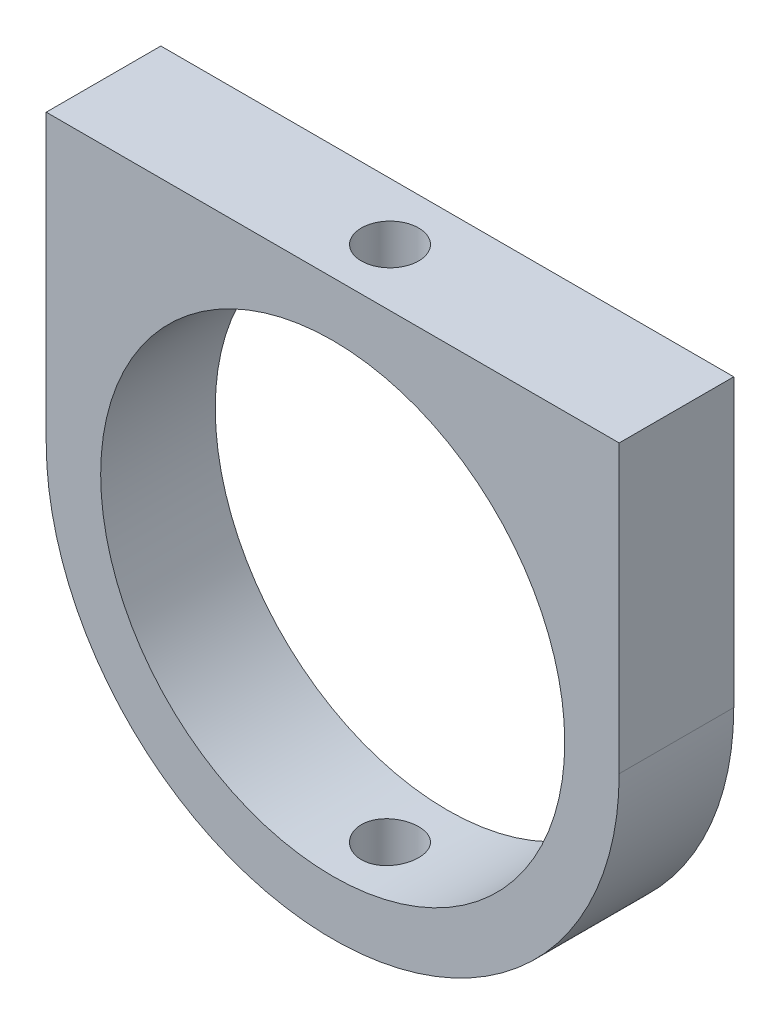
ISO-10303-21;
HEADER;
FILE_DESCRIPTION(('STEP AP214'),'2;1');
FILE_NAME('part.step','',(''),(''),'','','');
FILE_SCHEMA(('AUTOMOTIVE_DESIGN { 1 0 10303 214 1 1 1 1 }'));
ENDSEC;
DATA;
#1=APPLICATION_CONTEXT('core data for automotive mechanical design processes');
#2=APPLICATION_PROTOCOL_DEFINITION('international standard','automotive_design',2000,#1);
#3=PRODUCT_CONTEXT('',#1,'mechanical');
#4=PRODUCT('Part','Part','',(#3));
#5=PRODUCT_RELATED_PRODUCT_CATEGORY('part','',(#4));
#6=PRODUCT_DEFINITION_FORMATION('','',#4);
#7=PRODUCT_DEFINITION_CONTEXT('part definition',#1,'design');
#8=PRODUCT_DEFINITION('design','',#6,#7);
#9=PRODUCT_DEFINITION_SHAPE('','',#8);
#10=(LENGTH_UNIT() NAMED_UNIT(*) SI_UNIT(.MILLI.,.METRE.));
#11=(NAMED_UNIT(*) PLANE_ANGLE_UNIT() SI_UNIT($,.RADIAN.));
#12=(NAMED_UNIT(*) SI_UNIT($,.STERADIAN.) SOLID_ANGLE_UNIT());
#13=UNCERTAINTY_MEASURE_WITH_UNIT(LENGTH_MEASURE(1.E-05),#10,'distance_accuracy_value','');
#14=(GEOMETRIC_REPRESENTATION_CONTEXT(3) GLOBAL_UNCERTAINTY_ASSIGNED_CONTEXT((#13)) GLOBAL_UNIT_ASSIGNED_CONTEXT((#10,
#11,#12)) REPRESENTATION_CONTEXT('',''));
#15=CARTESIAN_POINT('',(0.,0.,0.));
#16=DIRECTION('',(0.,0.,1.));
#17=DIRECTION('',(1.,0.,0.));
#18=AXIS2_PLACEMENT_3D('',#15,#16,#17);
#19=CARTESIAN_POINT('',(-10.,0.,4.));
#20=DIRECTION('',(-1.,0.,0.));
#21=DIRECTION('',(0.,0.,1.));
#22=AXIS2_PLACEMENT_3D('',#19,#20,#21);
#23=PLANE('',#22);
#24=DIRECTION('',(0.,1.,0.));
#25=VECTOR('',#24,1.);
#26=CARTESIAN_POINT('',(-10.,0.,0.));
#27=LINE('',#26,#25);
#28=CARTESIAN_POINT('',(-10.,0.,0.));
#29=VERTEX_POINT('',#28);
#30=CARTESIAN_POINT('',(-10.,10.,0.));
#31=VERTEX_POINT('',#30);
#32=EDGE_CURVE('E107',#29,#31,#27,.T.);
#33=ORIENTED_EDGE('',*,*,#32,.F.);
#34=DIRECTION('',(0.,0.,-1.));
#35=VECTOR('',#34,1.);
#36=CARTESIAN_POINT('',(-10.,0.,4.));
#37=LINE('',#36,#35);
#38=CARTESIAN_POINT('',(-10.,0.,4.));
#39=VERTEX_POINT('',#38);
#40=EDGE_CURVE('E11',#39,#29,#37,.T.);
#41=ORIENTED_EDGE('',*,*,#40,.F.);
#42=DIRECTION('',(0.,1.,0.));
#43=VECTOR('',#42,1.);
#44=CARTESIAN_POINT('',(-10.,0.,4.));
#45=LINE('',#44,#43);
#46=CARTESIAN_POINT('',(-10.,10.,4.));
#47=VERTEX_POINT('',#46);
#48=EDGE_CURVE('E91',#39,#47,#45,.T.);
#49=ORIENTED_EDGE('',*,*,#48,.T.);
#50=DIRECTION('',(0.,0.,-1.));
#51=VECTOR('',#50,1.);
#52=CARTESIAN_POINT('',(-10.,10.,4.));
#53=LINE('',#52,#51);
#54=EDGE_CURVE('E53',#47,#31,#53,.T.);
#55=ORIENTED_EDGE('',*,*,#54,.T.);
#56=EDGE_LOOP('',(#33,#41,#49,#55));
#57=FACE_BOUND('',#56,.T.);
#58=ADVANCED_FACE('F35',(#57),#23,.T.);
#59=CARTESIAN_POINT('',(0.,0.,4.));
#60=DIRECTION('',(0.,0.,-1.));
#61=DIRECTION('',(-1.,0.,0.));
#62=AXIS2_PLACEMENT_3D('',#59,#60,#61);
#63=CYLINDRICAL_SURFACE('',#62,10.);
#64=CARTESIAN_POINT('',(0.,-10.,3.));
#65=CARTESIAN_POINT('',(0.0560203537915573,-9.9999993552077,2.99999757409962));
#66=CARTESIAN_POINT('',(0.112077745167773,-9.99952425596206,2.99527673110356));
#67=CARTESIAN_POINT('',(0.222638398496837,-9.99767467594738,2.97651562970957));
#68=CARTESIAN_POINT('',(0.277139879168828,-9.99629920434026,2.96246510397541));
#69=CARTESIAN_POINT('',(0.382971675453415,-9.9928041456307,2.92545775940217));
#70=CARTESIAN_POINT('',(0.43430388461491,-9.99068500800708,2.90250631948153));
#71=CARTESIAN_POINT('',(0.532376160960407,-9.98593957394306,2.84835909206836));
#72=CARTESIAN_POINT('',(0.579117138779077,-9.98331337838132,2.81716494399986));
#73=CARTESIAN_POINT('',(0.666859550674082,-9.97783744341324,2.74729730233773));
#74=CARTESIAN_POINT('',(0.707842144834892,-9.97498701573866,2.70860020059797));
#75=CARTESIAN_POINT('',(0.782742521430984,-9.96938956906263,2.62487546573697));
#76=CARTESIAN_POINT('',(0.816659977082653,-9.96664255484917,2.57984753995761));
#77=CARTESIAN_POINT('',(0.876533970443617,-9.96155591552784,2.48462146831638));
#78=CARTESIAN_POINT('',(0.902473465454879,-9.95921716710905,2.43441255590514));
#79=CARTESIAN_POINT('',(0.94554638474276,-9.95522037546525,2.33032441409502));
#80=CARTESIAN_POINT('',(0.962680026591291,-9.95356231542222,2.27644527541605));
#81=CARTESIAN_POINT('',(0.987599041601894,-9.95112084072978,2.16673819913399));
#82=CARTESIAN_POINT('',(0.995415653003795,-9.95033450398097,2.11091742314779));
#83=CARTESIAN_POINT('',(1.00157528513536,-9.94971643060526,1.99875113660422));
#84=CARTESIAN_POINT('',(0.999918554870802,-9.94988466888746,1.94240563987794));
#85=CARTESIAN_POINT('',(0.987204280252678,-9.95115406898935,1.83100469030668));
#86=CARTESIAN_POINT('',(0.976180844124552,-9.95225184590651,1.77594530067131));
#87=CARTESIAN_POINT('',(0.945099144150586,-9.95525134287419,1.66846203679891));
#88=CARTESIAN_POINT('',(0.925040758255746,-9.95715307378492,1.61603819817497));
#89=CARTESIAN_POINT('',(0.876420893881507,-9.9615500945207,1.51520641270111));
#90=CARTESIAN_POINT('',(0.847844282719979,-9.96404643908158,1.46680581051068));
#91=CARTESIAN_POINT('',(0.783010027353227,-9.96935051732879,1.37547478508812));
#92=CARTESIAN_POINT('',(0.746752158336505,-9.97215826012785,1.33254452201824));
#93=CARTESIAN_POINT('',(0.667394112412069,-9.9777838531299,1.25317460601097));
#94=CARTESIAN_POINT('',(0.624264478851363,-9.98060169332997,1.21676439811919));
#95=CARTESIAN_POINT('',(0.532489481737112,-9.98591829078518,1.15169636708961));
#96=CARTESIAN_POINT('',(0.4838441119996,-9.98841704768256,1.12303855264352));
#97=CARTESIAN_POINT('',(0.382398105692364,-9.99281475667096,1.07428997968975));
#98=CARTESIAN_POINT('',(0.329596746389903,-9.9947136041477,1.05420071518194));
#99=CARTESIAN_POINT('',(0.221347217329931,-9.99769647441409,1.02318108328825));
#100=CARTESIAN_POINT('',(0.1658991267766,-9.99878052157064,1.01225044200938));
#101=CARTESIAN_POINT('',(0.0541850990919031,-10.0000085166831,0.999895692265235));
#102=CARTESIAN_POINT('',(-0.00207630210549259,-10.0001564826774,0.998430951747501));
#103=CARTESIAN_POINT('',(-0.1140437933157,-9.99950641756797,1.00494286304876));
#104=CARTESIAN_POINT('',(-0.169749890820471,-9.99870839924468,1.01291938731528));
#105=CARTESIAN_POINT('',(-0.278908206834675,-9.99625861539194,1.03805369542158));
#106=CARTESIAN_POINT('',(-0.33236484897202,-9.99460861918039,1.05519245447801));
#107=CARTESIAN_POINT('',(-0.435644321383782,-9.99063998860609,1.09814517403727));
#108=CARTESIAN_POINT('',(-0.485467070157118,-9.98832133925254,1.1239593290394));
#109=CARTESIAN_POINT('',(-0.580248180172143,-9.98326475330422,1.18363083866391));
#110=CARTESIAN_POINT('',(-0.625189659748918,-9.98052543603441,1.21751488892582));
#111=CARTESIAN_POINT('',(-0.708761623311879,-9.97493932869521,1.29232606774093));
#112=CARTESIAN_POINT('',(-0.747391948849177,-9.97209253592971,1.33325337307032));
#113=CARTESIAN_POINT('',(-0.817386109887146,-9.96660024140755,1.421166574659));
#114=CARTESIAN_POINT('',(-0.848723278679543,-9.96395550138975,1.46817375654262));
#115=CARTESIAN_POINT('',(-0.903058258743828,-9.9591783246089,1.56680736014669));
#116=CARTESIAN_POINT('',(-0.926056184053882,-9.95704588084038,1.6184337186884));
#117=CARTESIAN_POINT('',(-0.963015208684475,-9.95353947634049,1.72474873946579));
#118=CARTESIAN_POINT('',(-0.976992174811862,-9.95216418449789,1.77943184009112));
#119=CARTESIAN_POINT('',(-0.995564007129463,-9.95032365282877,1.89038319796077));
#120=CARTESIAN_POINT('',(-1.00015914239952,-9.94985838690186,1.94665140969567));
#121=CARTESIAN_POINT('',(-0.999833138471256,-9.94989113107562,2.05891068835671));
#122=CARTESIAN_POINT('',(-0.994953889593112,-9.95038490087009,2.11490188288282));
#123=CARTESIAN_POINT('',(-0.975905452963652,-9.95227103889546,2.22526491716829));
#124=CARTESIAN_POINT('',(-0.961736254762159,-9.95366340813718,2.27963675510598));
#125=CARTESIAN_POINT('',(-0.924521686297503,-9.95718868263187,2.38521734904786));
#126=CARTESIAN_POINT('',(-0.901477544340915,-9.95932148540361,2.43642654162973));
#127=CARTESIAN_POINT('',(-0.847171554911043,-9.96408751839359,2.53425689167104));
#128=CARTESIAN_POINT('',(-0.815909753455414,-9.96672074580951,2.58087807482063));
#129=CARTESIAN_POINT('',(-0.745898556285331,-9.97220487209698,2.66842367447194));
#130=CARTESIAN_POINT('',(-0.707117948890268,-9.97505664726751,2.70932307636709));
#131=CARTESIAN_POINT('',(-0.623231699225109,-9.98064854728783,2.78405223269966));
#132=CARTESIAN_POINT('',(-0.578124544108256,-9.98338864522976,2.81788029135717));
#133=CARTESIAN_POINT('',(-0.482741434161288,-9.98845562069162,2.87757345385462));
#134=CARTESIAN_POINT('',(-0.432452749346763,-9.99078144026812,2.90341829094518));
#135=CARTESIAN_POINT('',(-0.32825827910055,-9.99474629249896,2.94626242282387));
#136=CARTESIAN_POINT('',(-0.274356649825608,-9.99638609909654,2.96327169095355));
#137=CARTESIAN_POINT('',(-0.183458261405704,-9.99838213773734,2.9837206170848));
#138=CARTESIAN_POINT('',(-0.147042552844509,-9.99898600691833,2.98981704429936));
#139=CARTESIAN_POINT('',(-0.0737565808173129,-9.99979514950786,2.99795752606176));
#140=CARTESIAN_POINT('',(-0.0368863192265578,-10.0000004245602,3.00000159732186));
#141=CARTESIAN_POINT('',(0.,-10.,3.));
#142=B_SPLINE_CURVE_WITH_KNOTS('',3,(#64,#65,#66,#67,#68,#69,#70,#71,#72,#73,#74,#75,#76,#77,
#78,#79,#80,#81,#82,#83,#84,#85,#86,#87,#88,#89,#90,#91,#92,#93,#94,#95,#96,#97,#98,#99,#100,
#101,#102,#103,#104,#105,#106,#107,#108,#109,#110,#111,#112,#113,#114,#115,#116,#117,#118,#119,
#120,#121,#122,#123,#124,#125,#126,#127,#128,#129,#130,#131,#132,#133,#134,#135,#136,#137,#138,
#139,#140,#141),.UNSPECIFIED.,.T.,.F.,(4,2,2,2,2,2,2,2,2,2,2,2,2,2,2,2,2,2,2,2,2,2,2,2,2,2,2,2,
2,2,2,2,2,2,2,2,2,2,4),(0.,0.167926366268474,0.336037842835486,0.504047885732203,
0.672024537582782,0.840538568622945,1.00906039220706,1.17793975472222,1.34681494442504,
1.51512232045197,1.68342527255777,1.85111797441111,2.01881294161634,2.18680761372895,
2.35480720331125,2.52354734196207,2.69228766979772,2.86105740693582,3.02982209675439,
3.19786188607758,3.36589940519143,3.53358935294305,3.70128306049467,3.86953940748698,
4.0377999781023,4.20666643608598,4.37553058475374,4.54409690593003,4.71265839239585,
4.88047629293956,5.0482943822604,5.216089253628,5.3838831853896,5.55238917427653,
5.72093552636958,5.88990631026242,6.05868594795295,6.16925667232348,6.27982694069027),.UNSPECIFIED.);
#143=CARTESIAN_POINT('',(0.,-10.,3.));
#144=VERTEX_POINT('',#143);
#145=EDGE_CURVE('E112',#144,#144,#142,.T.);
#146=ORIENTED_EDGE('',*,*,#145,.T.);
#147=EDGE_LOOP('',(#146));
#148=FACE_BOUND('',#147,.T.);
#149=CARTESIAN_POINT('',(0.,0.,0.));
#150=DIRECTION('',(0.,0.,1.));
#151=DIRECTION('',(1.,0.,0.));
#152=AXIS2_PLACEMENT_3D('',#149,#150,#151);
#153=CIRCLE('',#152,10.);
#154=CARTESIAN_POINT('',(10.,0.,0.));
#155=VERTEX_POINT('',#154);
#156=EDGE_CURVE('E96',#29,#155,#153,.T.);
#157=ORIENTED_EDGE('',*,*,#156,.T.);
#158=DIRECTION('',(0.,0.,-1.));
#159=VECTOR('',#158,1.);
#160=CARTESIAN_POINT('',(10.,0.,4.));
#161=LINE('',#160,#159);
#162=CARTESIAN_POINT('',(10.,0.,4.));
#163=VERTEX_POINT('',#162);
#164=EDGE_CURVE('E45',#163,#155,#161,.T.);
#165=ORIENTED_EDGE('',*,*,#164,.F.);
#166=CARTESIAN_POINT('',(0.,0.,4.));
#167=DIRECTION('',(0.,0.,1.));
#168=DIRECTION('',(1.,0.,0.));
#169=AXIS2_PLACEMENT_3D('',#166,#167,#168);
#170=CIRCLE('',#169,10.);
#171=EDGE_CURVE('E87',#39,#163,#170,.T.);
#172=ORIENTED_EDGE('',*,*,#171,.F.);
#173=ORIENTED_EDGE('',*,*,#40,.T.);
#174=EDGE_LOOP('',(#157,#165,#172,#173));
#175=FACE_BOUND('',#174,.T.);
#176=ADVANCED_FACE('F94',(#148,#175),#63,.T.);
#177=CARTESIAN_POINT('',(10.,0.,4.));
#178=DIRECTION('',(-1.,0.,0.));
#179=DIRECTION('',(0.,0.,1.));
#180=AXIS2_PLACEMENT_3D('',#177,#178,#179);
#181=PLANE('',#180);
#182=DIRECTION('',(0.,1.,0.));
#183=VECTOR('',#182,1.);
#184=CARTESIAN_POINT('',(10.,0.,0.));
#185=LINE('',#184,#183);
#186=CARTESIAN_POINT('',(10.,10.,0.));
#187=VERTEX_POINT('',#186);
#188=EDGE_CURVE('E104',#155,#187,#185,.T.);
#189=ORIENTED_EDGE('',*,*,#188,.T.);
#190=DIRECTION('',(0.,0.,-1.));
#191=VECTOR('',#190,1.);
#192=CARTESIAN_POINT('',(10.,10.,4.));
#193=LINE('',#192,#191);
#194=CARTESIAN_POINT('',(10.,10.,4.));
#195=VERTEX_POINT('',#194);
#196=EDGE_CURVE('E67',#195,#187,#193,.T.);
#197=ORIENTED_EDGE('',*,*,#196,.F.);
#198=DIRECTION('',(0.,1.,0.));
#199=VECTOR('',#198,1.);
#200=CARTESIAN_POINT('',(10.,0.,4.));
#201=LINE('',#200,#199);
#202=EDGE_CURVE('E79',#163,#195,#201,.T.);
#203=ORIENTED_EDGE('',*,*,#202,.F.);
#204=ORIENTED_EDGE('',*,*,#164,.T.);
#205=EDGE_LOOP('',(#189,#197,#203,#204));
#206=FACE_BOUND('',#205,.T.);
#207=ADVANCED_FACE('F81',(#206),#181,.F.);
#208=CARTESIAN_POINT('',(0.,0.,4.));
#209=DIRECTION('',(0.,0.,-1.));
#210=DIRECTION('',(-1.,0.,0.));
#211=AXIS2_PLACEMENT_3D('',#208,#209,#210);
#212=CYLINDRICAL_SURFACE('',#211,8.1);
#213=CARTESIAN_POINT('',(0.,-8.1,3.));
#214=CARTESIAN_POINT('',(0.0559421467433299,-8.09999922741937,2.99999761994337));
#215=CARTESIAN_POINT('',(0.111919389029058,-8.09941433539592,2.99528988847951));
#216=CARTESIAN_POINT('',(0.222316609962162,-8.09713734435104,2.97658391759148));
#217=CARTESIAN_POINT('',(0.276734894056091,-8.09544408491826,2.96257594100484));
#218=CARTESIAN_POINT('',(0.382399960320261,-8.09114114001845,2.92568814185259));
#219=CARTESIAN_POINT('',(0.433648835900762,-8.08853206722158,2.90281424943395));
#220=CARTESIAN_POINT('',(0.531570592610796,-8.08268778329365,2.84885679693369));
#221=CARTESIAN_POINT('',(0.578244265242837,-8.07945268075372,2.81777466031379));
#222=CARTESIAN_POINT('',(0.665951461581988,-8.07269816886397,2.74810434629734));
#223=CARTESIAN_POINT('',(0.706956850183507,-8.06917746991779,2.70948087139345));
#224=CARTESIAN_POINT('',(0.781921210575561,-8.06225898575994,2.62590001816894));
#225=CARTESIAN_POINT('',(0.815879825579884,-8.05886120677906,2.5809423193327));
#226=CARTESIAN_POINT('',(0.875891152826881,-8.05256054888837,2.48578678826392));
#227=CARTESIAN_POINT('',(0.901917562075162,-8.04965933020587,2.43557224823835));
#228=CARTESIAN_POINT('',(0.945157707766812,-8.04469722578763,2.3314433627894));
#229=CARTESIAN_POINT('',(0.962371770370088,-8.04263630895148,2.27752915438081));
#230=CARTESIAN_POINT('',(0.987413214267984,-8.0396004291658,2.16782306205652));
#231=CARTESIAN_POINT('',(0.995288051534376,-8.03861997779846,2.11204216493257));
#232=CARTESIAN_POINT('',(1.00157434170351,-8.03783922780068,1.99994257728938));
#233=CARTESIAN_POINT('',(0.999986166143074,-8.0380388828369,1.94362390797084));
#234=CARTESIAN_POINT('',(0.987430479432358,-8.03959076494516,1.83237794073794));
#235=CARTESIAN_POINT('',(0.976515211775962,-8.04093657197875,1.77744464412503));
#236=CARTESIAN_POINT('',(0.945696682628198,-8.04461910501935,1.67019547950926));
#237=CARTESIAN_POINT('',(0.925793243119296,-8.0469558506526,1.61787966337036));
#238=CARTESIAN_POINT('',(0.877507099359364,-8.05236425496117,1.51718802825759));
#239=CARTESIAN_POINT('',(0.849101660023145,-8.0554378796733,1.46882322168126));
#240=CARTESIAN_POINT('',(0.784634111746422,-8.06197219236468,1.37752716597243));
#241=CARTESIAN_POINT('',(0.74857166114684,-8.06543289761236,1.33459615943485));
#242=CARTESIAN_POINT('',(0.669524082283407,-8.07237998032577,1.25508309618507));
#243=CARTESIAN_POINT('',(0.626493916933987,-8.07586637355703,1.21854579937304));
#244=CARTESIAN_POINT('',(0.534887535004504,-8.08245015770334,1.15320571741146));
#245=CARTESIAN_POINT('',(0.486311306164644,-8.08554754775847,1.12440294935987));
#246=CARTESIAN_POINT('',(0.384957418193104,-8.09100618930941,1.07534962037938));
#247=CARTESIAN_POINT('',(0.332178406522372,-8.09336720261287,1.05510182593846));
#248=CARTESIAN_POINT('',(0.223933971213346,-8.09708489187725,1.02376855236505));
#249=CARTESIAN_POINT('',(0.168468670360631,-8.09844161369651,1.01268265487588));
#250=CARTESIAN_POINT('',(0.0568131699425722,-8.09999189798397,1.00004579194693));
#251=CARTESIAN_POINT('',(0.000630049907172368,-8.1001929828885,0.998433160248469));
#252=CARTESIAN_POINT('',(-0.111205648519718,-8.09942963731472,1.00462591999554));
#253=CARTESIAN_POINT('',(-0.166858237902062,-8.09846523103467,1.01243111590535));
#254=CARTESIAN_POINT('',(-0.275871415079483,-8.09548396217872,1.03718674589513));
#255=CARTESIAN_POINT('',(-0.329238772151461,-8.09347047993864,1.05410781270295));
#256=CARTESIAN_POINT('',(-0.432378270660616,-8.08861651404656,1.09658434918136));
#257=CARTESIAN_POINT('',(-0.482150292690404,-8.08577600294323,1.12214010546527));
#258=CARTESIAN_POINT('',(-0.576961912205816,-8.07956598002017,1.18131003779793));
#259=CARTESIAN_POINT('',(-0.621976416252224,-8.07619387631939,1.21496414593348));
#260=CARTESIAN_POINT('',(-0.705739989694124,-8.06930608952946,1.28931892048631));
#261=CARTESIAN_POINT('',(-0.744488816600735,-8.06579040089,1.33001985949785));
#262=CARTESIAN_POINT('',(-0.814839572602705,-8.05898851395506,1.41758440881579));
#263=CARTESIAN_POINT('',(-0.846400651747521,-8.05570369730784,1.46448096155431));
#264=CARTESIAN_POINT('',(-0.901197895148183,-8.04975808813212,1.56294548395444));
#265=CARTESIAN_POINT('',(-0.924434222825896,-8.04709728335408,1.61451336188911));
#266=CARTESIAN_POINT('',(-0.961856081742295,-8.04271032507821,1.72072434335534));
#267=CARTESIAN_POINT('',(-0.976064730842428,-8.04098178598848,1.77535919892161));
#268=CARTESIAN_POINT('',(-0.995102387633878,-8.0386481910181,1.88626203243829));
#269=CARTESIAN_POINT('',(-0.999931820107978,-8.03804308425747,1.94252993631114));
#270=CARTESIAN_POINT('',(-1.0000662905441,-8.03802632219156,2.05469525253527));
#271=CARTESIAN_POINT('',(-0.995435504469666,-8.03860662533402,2.11059259761621));
#272=CARTESIAN_POINT('',(-0.97691679722283,-8.04087801825031,2.22080806322932));
#273=CARTESIAN_POINT('',(-0.963028874312646,-8.04256910823268,2.27512618346503));
#274=CARTESIAN_POINT('',(-0.926410030686894,-8.04686906175994,2.38063339480483));
#275=CARTESIAN_POINT('',(-0.903682121110215,-8.04947761276383,2.43182354451756));
#276=CARTESIAN_POINT('',(-0.850034790926109,-8.05531909495582,2.52967372143967));
#277=CARTESIAN_POINT('',(-0.819115277645244,-8.05855203320764,2.57633369739003));
#278=CARTESIAN_POINT('',(-0.749724103367036,-8.06530429843633,2.66412715613726));
#279=CARTESIAN_POINT('',(-0.711204605816081,-8.06882535219166,2.70522269907101));
#280=CARTESIAN_POINT('',(-0.627806446454243,-8.07574182689939,2.78039145066254));
#281=CARTESIAN_POINT('',(-0.582926285977471,-8.07913721800535,2.8144629997067));
#282=CARTESIAN_POINT('',(-0.48789015730005,-8.08543367524378,2.87472384493644));
#283=CARTESIAN_POINT('',(-0.437715222782328,-8.08833285956033,2.90088341121514));
#284=CARTESIAN_POINT('',(-0.333677085780852,-8.09329109884716,2.94436831074609));
#285=CARTESIAN_POINT('',(-0.279817974196701,-8.09535106854533,2.96170326782697));
#286=CARTESIAN_POINT('',(-0.188065338859439,-8.09790076769708,2.98288564731205));
#287=CARTESIAN_POINT('',(-0.150750974329778,-8.09868415585033,2.98929433686887));
#288=CARTESIAN_POINT('',(-0.0756297518300401,-8.09973403133313,2.99785230261795));
#289=CARTESIAN_POINT('',(-0.037822897372681,-8.10000052234745,3.00000160917381));
#290=CARTESIAN_POINT('',(0.,-8.1,3.));
#291=B_SPLINE_CURVE_WITH_KNOTS('',3,(#213,#214,#215,#216,#217,#218,#219,#220,#221,#222,#223,
#224,#225,#226,#227,#228,#229,#230,#231,#232,#233,#234,#235,#236,#237,#238,#239,#240,#241,#242,
#243,#244,#245,#246,#247,#248,#249,#250,#251,#252,#253,#254,#255,#256,#257,#258,#259,#260,#261,
#262,#263,#264,#265,#266,#267,#268,#269,#270,#271,#272,#273,#274,#275,#276,#277,#278,#279,#280,
#281,#282,#283,#284,#285,#286,#287,#288,#289,#290),.UNSPECIFIED.,.T.,.F.,(4,2,2,2,2,2,2,2,2,2,2,
2,2,2,2,2,2,2,2,2,2,2,2,2,2,2,2,2,2,2,2,2,2,2,2,2,2,2,4),(0.,0.167688287858711,0.33555241929854,
0.503304464642078,0.671027437753082,0.839555123803083,1.00809134052191,1.17718048650679,
1.34626337376284,1.51448335758694,1.6826967368014,1.8499740388708,2.01725465413889,
2.18498665065476,2.35272613301662,2.52159660867716,2.69046745763993,2.85939287395638,
3.02831057626121,3.19612747897657,3.36394089748794,3.53121690088544,3.69849845726089,
3.86662240092383,4.03475284961943,4.2038162249713,4.37287628128515,4.54150164904548,
4.71011937961965,4.87759704487773,5.04507474157534,5.21249544072306,5.37991803401935,
5.54843013729207,5.7169820107102,5.88615958005681,6.0551522525173,6.16852834701992,
6.28190363330238),.UNSPECIFIED.);
#292=CARTESIAN_POINT('',(0.,-8.1,3.));
#293=VERTEX_POINT('',#292);
#294=EDGE_CURVE('E124',#293,#293,#291,.T.);
#295=ORIENTED_EDGE('',*,*,#294,.F.);
#296=EDGE_LOOP('',(#295));
#297=FACE_BOUND('',#296,.T.);
#298=CARTESIAN_POINT('',(0.,8.1,3.));
#299=CARTESIAN_POINT('',(-0.0559421467433299,8.09999922741937,2.99999761994337));
#300=CARTESIAN_POINT('',(-0.111919389029058,8.09941433539592,2.99528988847951));
#301=CARTESIAN_POINT('',(-0.222316609962162,8.09713734435104,2.97658391759148));
#302=CARTESIAN_POINT('',(-0.276734894056091,8.09544408491826,2.96257594100484));
#303=CARTESIAN_POINT('',(-0.382399960320261,8.09114114001845,2.92568814185259));
#304=CARTESIAN_POINT('',(-0.433648835900762,8.08853206722158,2.90281424943395));
#305=CARTESIAN_POINT('',(-0.531570592610796,8.08268778329365,2.84885679693369));
#306=CARTESIAN_POINT('',(-0.578244265242837,8.07945268075372,2.81777466031379));
#307=CARTESIAN_POINT('',(-0.665951461581988,8.07269816886397,2.74810434629734));
#308=CARTESIAN_POINT('',(-0.706956850183507,8.06917746991779,2.70948087139345));
#309=CARTESIAN_POINT('',(-0.781921210575561,8.06225898575994,2.62590001816894));
#310=CARTESIAN_POINT('',(-0.815879825579884,8.05886120677906,2.5809423193327));
#311=CARTESIAN_POINT('',(-0.875891152826881,8.05256054888837,2.48578678826392));
#312=CARTESIAN_POINT('',(-0.901917562075162,8.04965933020587,2.43557224823835));
#313=CARTESIAN_POINT('',(-0.945157707766812,8.04469722578763,2.3314433627894));
#314=CARTESIAN_POINT('',(-0.962371770370088,8.04263630895148,2.27752915438081));
#315=CARTESIAN_POINT('',(-0.987413214267984,8.03960042916579,2.16782306205652));
#316=CARTESIAN_POINT('',(-0.995288051534376,8.03861997779846,2.11204216493257));
#317=CARTESIAN_POINT('',(-1.00157434170351,8.03783922780068,1.99994257728938));
#318=CARTESIAN_POINT('',(-0.999986166143074,8.0380388828369,1.94362390797084));
#319=CARTESIAN_POINT('',(-0.987430479432358,8.03959076494516,1.83237794073794));
#320=CARTESIAN_POINT('',(-0.976515211775962,8.04093657197874,1.77744464412503));
#321=CARTESIAN_POINT('',(-0.945696682628198,8.04461910501935,1.67019547950926));
#322=CARTESIAN_POINT('',(-0.925793243119296,8.0469558506526,1.61787966337036));
#323=CARTESIAN_POINT('',(-0.877507099359364,8.05236425496116,1.51718802825759));
#324=CARTESIAN_POINT('',(-0.849101660023145,8.0554378796733,1.46882322168126));
#325=CARTESIAN_POINT('',(-0.784634111746423,8.06197219236468,1.37752716597243));
#326=CARTESIAN_POINT('',(-0.74857166114684,8.06543289761236,1.33459615943485));
#327=CARTESIAN_POINT('',(-0.669524082283407,8.07237998032577,1.25508309618507));
#328=CARTESIAN_POINT('',(-0.626493916933987,8.07586637355702,1.21854579937304));
#329=CARTESIAN_POINT('',(-0.534887535004504,8.08245015770334,1.15320571741146));
#330=CARTESIAN_POINT('',(-0.486311306164644,8.08554754775847,1.12440294935987));
#331=CARTESIAN_POINT('',(-0.384957418193104,8.09100618930941,1.07534962037938));
#332=CARTESIAN_POINT('',(-0.332178406522372,8.09336720261287,1.05510182593846));
#333=CARTESIAN_POINT('',(-0.223933971213346,8.09708489187725,1.02376855236505));
#334=CARTESIAN_POINT('',(-0.168468670360631,8.09844161369651,1.01268265487588));
#335=CARTESIAN_POINT('',(-0.0568131699425723,8.09999189798397,1.00004579194693));
#336=CARTESIAN_POINT('',(-0.00063004990717251,8.1001929828885,0.998433160248469));
#337=CARTESIAN_POINT('',(0.111205648519718,8.09942963731472,1.00462591999554));
#338=CARTESIAN_POINT('',(0.166858237902062,8.09846523103467,1.01243111590535));
#339=CARTESIAN_POINT('',(0.275871415079483,8.09548396217872,1.03718674589513));
#340=CARTESIAN_POINT('',(0.329238772151461,8.09347047993864,1.05410781270295));
#341=CARTESIAN_POINT('',(0.432378270660616,8.08861651404656,1.09658434918136));
#342=CARTESIAN_POINT('',(0.482150292690405,8.08577600294323,1.12214010546527));
#343=CARTESIAN_POINT('',(0.576961912205816,8.07956598002017,1.18131003779793));
#344=CARTESIAN_POINT('',(0.621976416252224,8.07619387631939,1.21496414593348));
#345=CARTESIAN_POINT('',(0.705739989694124,8.06930608952946,1.28931892048631));
#346=CARTESIAN_POINT('',(0.744488816600735,8.06579040089,1.33001985949785));
#347=CARTESIAN_POINT('',(0.814839572602705,8.05898851395506,1.41758440881579));
#348=CARTESIAN_POINT('',(0.846400651747521,8.05570369730784,1.46448096155431));
#349=CARTESIAN_POINT('',(0.901197895148183,8.04975808813212,1.56294548395444));
#350=CARTESIAN_POINT('',(0.924434222825896,8.04709728335408,1.61451336188911));
#351=CARTESIAN_POINT('',(0.961856081742295,8.04271032507821,1.72072434335534));
#352=CARTESIAN_POINT('',(0.976064730842428,8.04098178598848,1.77535919892161));
#353=CARTESIAN_POINT('',(0.995102387633878,8.0386481910181,1.88626203243829));
#354=CARTESIAN_POINT('',(0.999931820107978,8.03804308425747,1.94252993631114));
#355=CARTESIAN_POINT('',(1.0000662905441,8.03802632219156,2.05469525253527));
#356=CARTESIAN_POINT('',(0.995435504469666,8.03860662533402,2.11059259761621));
#357=CARTESIAN_POINT('',(0.97691679722283,8.04087801825032,2.22080806322932));
#358=CARTESIAN_POINT('',(0.963028874312646,8.04256910823268,2.27512618346503));
#359=CARTESIAN_POINT('',(0.926410030686894,8.04686906175994,2.38063339480483));
#360=CARTESIAN_POINT('',(0.903682121110215,8.04947761276383,2.43182354451756));
#361=CARTESIAN_POINT('',(0.850034790926109,8.05531909495582,2.52967372143967));
#362=CARTESIAN_POINT('',(0.819115277645245,8.05855203320764,2.57633369739003));
#363=CARTESIAN_POINT('',(0.749724103367036,8.06530429843633,2.66412715613726));
#364=CARTESIAN_POINT('',(0.711204605816081,8.06882535219166,2.70522269907101));
#365=CARTESIAN_POINT('',(0.627806446454243,8.07574182689939,2.78039145066254));
#366=CARTESIAN_POINT('',(0.582926285977471,8.07913721800535,2.8144629997067));
#367=CARTESIAN_POINT('',(0.48789015730005,8.08543367524378,2.87472384493644));
#368=CARTESIAN_POINT('',(0.437715222782328,8.08833285956033,2.90088341121514));
#369=CARTESIAN_POINT('',(0.333677085780852,8.09329109884716,2.94436831074609));
#370=CARTESIAN_POINT('',(0.279817974196701,8.09535106854533,2.96170326782697));
#371=CARTESIAN_POINT('',(0.18806533885944,8.09790076769708,2.98288564731205));
#372=CARTESIAN_POINT('',(0.150750974329778,8.09868415585033,2.98929433686887));
#373=CARTESIAN_POINT('',(0.0756297518300401,8.09973403133313,2.99785230261795));
#374=CARTESIAN_POINT('',(0.037822897372681,8.10000052234745,3.00000160917381));
#375=CARTESIAN_POINT('',(0.,8.1,3.));
#376=B_SPLINE_CURVE_WITH_KNOTS('',3,(#298,#299,#300,#301,#302,#303,#304,#305,#306,#307,#308,
#309,#310,#311,#312,#313,#314,#315,#316,#317,#318,#319,#320,#321,#322,#323,#324,#325,#326,#327,
#328,#329,#330,#331,#332,#333,#334,#335,#336,#337,#338,#339,#340,#341,#342,#343,#344,#345,#346,
#347,#348,#349,#350,#351,#352,#353,#354,#355,#356,#357,#358,#359,#360,#361,#362,#363,#364,#365,
#366,#367,#368,#369,#370,#371,#372,#373,#374,#375),.UNSPECIFIED.,.T.,.F.,(4,2,2,2,2,2,2,2,2,2,2,
2,2,2,2,2,2,2,2,2,2,2,2,2,2,2,2,2,2,2,2,2,2,2,2,2,2,2,4),(0.,0.167688287858711,0.33555241929854,
0.503304464642078,0.671027437753082,0.839555123803083,1.00809134052191,1.1771804865068,
1.34626337376284,1.51448335758694,1.6826967368014,1.8499740388708,2.01725465413889,
2.18498665065476,2.35272613301662,2.52159660867716,2.69046745763993,2.85939287395638,
3.02831057626121,3.19612747897657,3.36394089748794,3.53121690088544,3.69849845726089,
3.86662240092383,4.03475284961943,4.2038162249713,4.37287628128515,4.54150164904548,
4.71011937961965,4.87759704487773,5.04507474157534,5.21249544072306,5.37991803401935,
5.54843013729207,5.7169820107102,5.88615958005681,6.0551522525173,6.16852834701992,
6.28190363330238),.UNSPECIFIED.);
#377=CARTESIAN_POINT('',(0.,8.1,3.));
#378=VERTEX_POINT('',#377);
#379=EDGE_CURVE('E141',#378,#378,#376,.T.);
#380=ORIENTED_EDGE('',*,*,#379,.F.);
#381=EDGE_LOOP('',(#380));
#382=FACE_BOUND('',#381,.T.);
#383=CARTESIAN_POINT('',(0.,0.,4.));
#384=DIRECTION('',(0.,0.,1.));
#385=DIRECTION('',(1.,0.,0.));
#386=AXIS2_PLACEMENT_3D('',#383,#384,#385);
#387=CIRCLE('',#386,8.1);
#388=CARTESIAN_POINT('',(8.1,0.,4.));
#389=VERTEX_POINT('',#388);
#390=EDGE_CURVE('E103',#389,#389,#387,.T.);
#391=ORIENTED_EDGE('',*,*,#390,.T.);
#392=EDGE_LOOP('',(#391));
#393=FACE_BOUND('',#392,.T.);
#394=CARTESIAN_POINT('',(0.,0.,0.));
#395=DIRECTION('',(0.,0.,1.));
#396=DIRECTION('',(1.,0.,0.));
#397=AXIS2_PLACEMENT_3D('',#394,#395,#396);
#398=CIRCLE('',#397,8.1);
#399=CARTESIAN_POINT('',(8.1,0.,0.));
#400=VERTEX_POINT('',#399);
#401=EDGE_CURVE('E109',#400,#400,#398,.T.);
#402=ORIENTED_EDGE('',*,*,#401,.F.);
#403=EDGE_LOOP('',(#402));
#404=FACE_BOUND('',#403,.T.);
#405=ADVANCED_FACE('F37',(#297,#382,#393,#404),#212,.F.);
#406=CARTESIAN_POINT('',(0.,10.,4.));
#407=DIRECTION('',(0.,1.,0.));
#408=DIRECTION('',(0.,0.,1.));
#409=AXIS2_PLACEMENT_3D('',#406,#407,#408);
#410=PLANE('',#409);
#411=CARTESIAN_POINT('',(0.,10.,2.));
#412=DIRECTION('',(0.,1.,0.));
#413=DIRECTION('',(0.,0.,1.));
#414=AXIS2_PLACEMENT_3D('',#411,#412,#413);
#415=CIRCLE('',#414,1.);
#416=CARTESIAN_POINT('',(0.,10.,3.));
#417=VERTEX_POINT('',#416);
#418=EDGE_CURVE('E147',#417,#417,#415,.T.);
#419=ORIENTED_EDGE('',*,*,#418,.F.);
#420=EDGE_LOOP('',(#419));
#421=FACE_BOUND('',#420,.T.);
#422=DIRECTION('',(1.,0.,0.));
#423=VECTOR('',#422,1.);
#424=CARTESIAN_POINT('',(0.,10.,0.));
#425=LINE('',#424,#423);
#426=EDGE_CURVE('E100',#31,#187,#425,.T.);
#427=ORIENTED_EDGE('',*,*,#426,.F.);
#428=ORIENTED_EDGE('',*,*,#54,.F.);
#429=DIRECTION('',(1.,0.,0.));
#430=VECTOR('',#429,1.);
#431=CARTESIAN_POINT('',(0.,10.,4.));
#432=LINE('',#431,#430);
#433=EDGE_CURVE('E86',#47,#195,#432,.T.);
#434=ORIENTED_EDGE('',*,*,#433,.T.);
#435=ORIENTED_EDGE('',*,*,#196,.T.);
#436=EDGE_LOOP('',(#427,#428,#434,#435));
#437=FACE_BOUND('',#436,.T.);
#438=ADVANCED_FACE('F152',(#421,#437),#410,.T.);
#439=CARTESIAN_POINT('',(0.,0.,4.));
#440=DIRECTION('',(0.,0.,1.));
#441=DIRECTION('',(1.,0.,0.));
#442=AXIS2_PLACEMENT_3D('',#439,#440,#441);
#443=PLANE('',#442);
#444=ORIENTED_EDGE('',*,*,#390,.F.);
#445=EDGE_LOOP('',(#444));
#446=FACE_BOUND('',#445,.T.);
#447=ORIENTED_EDGE('',*,*,#48,.F.);
#448=ORIENTED_EDGE('',*,*,#171,.T.);
#449=ORIENTED_EDGE('',*,*,#202,.T.);
#450=ORIENTED_EDGE('',*,*,#433,.F.);
#451=EDGE_LOOP('',(#447,#448,#449,#450));
#452=FACE_BOUND('',#451,.T.);
#453=ADVANCED_FACE('F90',(#446,#452),#443,.T.);
#454=CARTESIAN_POINT('',(0.,0.,0.));
#455=DIRECTION('',(0.,0.,1.));
#456=DIRECTION('',(1.,0.,0.));
#457=AXIS2_PLACEMENT_3D('',#454,#455,#456);
#458=PLANE('',#457);
#459=ORIENTED_EDGE('',*,*,#401,.T.);
#460=EDGE_LOOP('',(#459));
#461=FACE_BOUND('',#460,.T.);
#462=ORIENTED_EDGE('',*,*,#32,.T.);
#463=ORIENTED_EDGE('',*,*,#426,.T.);
#464=ORIENTED_EDGE('',*,*,#188,.F.);
#465=ORIENTED_EDGE('',*,*,#156,.F.);
#466=EDGE_LOOP('',(#462,#463,#464,#465));
#467=FACE_BOUND('',#466,.T.);
#468=ADVANCED_FACE('F136',(#461,#467),#458,.F.);
#469=CARTESIAN_POINT('',(0.,-10.,2.));
#470=DIRECTION('',(0.,1.,0.));
#471=DIRECTION('',(0.,0.,1.));
#472=AXIS2_PLACEMENT_3D('',#469,#470,#471);
#473=CYLINDRICAL_SURFACE('',#472,1.);
#474=ORIENTED_EDGE('',*,*,#379,.T.);
#475=EDGE_LOOP('',(#474));
#476=FACE_BOUND('',#475,.T.);
#477=ORIENTED_EDGE('',*,*,#418,.T.);
#478=EDGE_LOOP('',(#477));
#479=FACE_BOUND('',#478,.T.);
#480=ADVANCED_FACE('F131',(#476,#479),#473,.F.);
#481=ORIENTED_EDGE('',*,*,#294,.T.);
#482=EDGE_LOOP('',(#481));
#483=FACE_BOUND('',#482,.T.);
#484=ORIENTED_EDGE('',*,*,#145,.F.);
#485=EDGE_LOOP('',(#484));
#486=FACE_BOUND('',#485,.T.);
#487=ADVANCED_FACE('F135',(#483,#486),#473,.F.);
#488=CLOSED_SHELL('',(#58,#176,#207,#405,#438,#453,#468,#480,#487));
#489=MANIFOLD_SOLID_BREP('B2',#488);
#490=ADVANCED_BREP_SHAPE_REPRESENTATION('',(#18,#489),#14);
#491=SHAPE_DEFINITION_REPRESENTATION(#9,#490);
ENDSEC;
END-ISO-10303-21;
